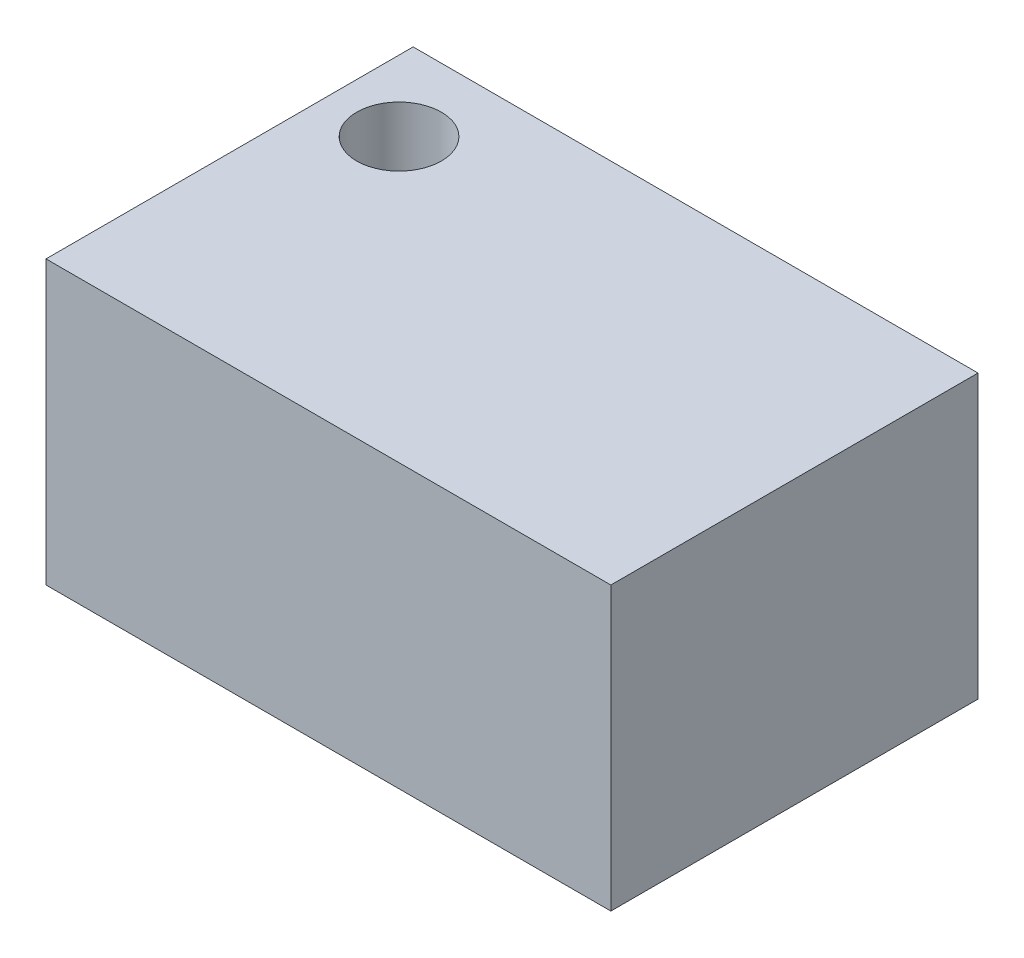
ISO-10303-21;
HEADER;
FILE_DESCRIPTION(('STEP AP214'),'2;1');
FILE_NAME('part.step','',(''),(''),'','','');
FILE_SCHEMA(('AUTOMOTIVE_DESIGN { 1 0 10303 214 1 1 1 1 }'));
ENDSEC;
DATA;
#1=APPLICATION_CONTEXT('core data for automotive mechanical design processes');
#2=APPLICATION_PROTOCOL_DEFINITION('international standard','automotive_design',2000,#1);
#3=PRODUCT_CONTEXT('',#1,'mechanical');
#4=PRODUCT('Part','Part','',(#3));
#5=PRODUCT_RELATED_PRODUCT_CATEGORY('part','',(#4));
#6=PRODUCT_DEFINITION_FORMATION('','',#4);
#7=PRODUCT_DEFINITION_CONTEXT('part definition',#1,'design');
#8=PRODUCT_DEFINITION('design','',#6,#7);
#9=PRODUCT_DEFINITION_SHAPE('','',#8);
#10=(LENGTH_UNIT() NAMED_UNIT(*) SI_UNIT(.MILLI.,.METRE.));
#11=(NAMED_UNIT(*) PLANE_ANGLE_UNIT() SI_UNIT($,.RADIAN.));
#12=(NAMED_UNIT(*) SI_UNIT($,.STERADIAN.) SOLID_ANGLE_UNIT());
#13=UNCERTAINTY_MEASURE_WITH_UNIT(LENGTH_MEASURE(1.E-05),#10,'distance_accuracy_value','');
#14=(GEOMETRIC_REPRESENTATION_CONTEXT(3) GLOBAL_UNCERTAINTY_ASSIGNED_CONTEXT((#13)) GLOBAL_UNIT_ASSIGNED_CONTEXT((#10,
#11,#12)) REPRESENTATION_CONTEXT('',''));
#15=CARTESIAN_POINT('',(0.,0.,0.));
#16=DIRECTION('',(0.,0.,1.));
#17=DIRECTION('',(1.,0.,0.));
#18=AXIS2_PLACEMENT_3D('',#15,#16,#17);
#19=CARTESIAN_POINT('',(0.,10.,0.));
#20=DIRECTION('',(0.,-1.,0.));
#21=DIRECTION('',(0.,0.,-1.));
#22=AXIS2_PLACEMENT_3D('',#19,#20,#21);
#23=PLANE('',#22);
#24=DIRECTION('',(0.,0.,-1.));
#25=VECTOR('',#24,1.);
#26=CARTESIAN_POINT('',(10.,10.,6.5));
#27=LINE('',#26,#25);
#28=CARTESIAN_POINT('',(10.,10.,6.5));
#29=VERTEX_POINT('',#28);
#30=CARTESIAN_POINT('',(10.,10.,-6.5));
#31=VERTEX_POINT('',#30);
#32=EDGE_CURVE('E85',#29,#31,#27,.T.);
#33=ORIENTED_EDGE('',*,*,#32,.T.);
#34=DIRECTION('',(-1.,0.,0.));
#35=VECTOR('',#34,1.);
#36=CARTESIAN_POINT('',(-10.,10.,-6.5));
#37=LINE('',#36,#35);
#38=CARTESIAN_POINT('',(-10.,10.,-6.5));
#39=VERTEX_POINT('',#38);
#40=EDGE_CURVE('E80',#31,#39,#37,.T.);
#41=ORIENTED_EDGE('',*,*,#40,.T.);
#42=DIRECTION('',(0.,0.,1.));
#43=VECTOR('',#42,1.);
#44=CARTESIAN_POINT('',(-10.,10.,6.5));
#45=LINE('',#44,#43);
#46=CARTESIAN_POINT('',(-10.,10.,6.5));
#47=VERTEX_POINT('',#46);
#48=EDGE_CURVE('E83',#39,#47,#45,.T.);
#49=ORIENTED_EDGE('',*,*,#48,.T.);
#50=DIRECTION('',(1.,0.,0.));
#51=VECTOR('',#50,1.);
#52=CARTESIAN_POINT('',(-10.,10.,6.5));
#53=LINE('',#52,#51);
#54=EDGE_CURVE('E50',#47,#29,#53,.T.);
#55=ORIENTED_EDGE('',*,*,#54,.T.);
#56=EDGE_LOOP('',(#33,#41,#49,#55));
#57=FACE_BOUND('',#56,.T.);
#58=CARTESIAN_POINT('',(-7.5,10.,-3.5));
#59=DIRECTION('',(0.,1.,0.));
#60=DIRECTION('',(0.,0.,1.));
#61=AXIS2_PLACEMENT_3D('',#58,#59,#60);
#62=CIRCLE('',#61,1.5);
#63=CARTESIAN_POINT('',(-7.5,10.,-2.));
#64=VERTEX_POINT('',#63);
#65=EDGE_CURVE('E100',#64,#64,#62,.T.);
#66=ORIENTED_EDGE('',*,*,#65,.F.);
#67=EDGE_LOOP('',(#66));
#68=FACE_BOUND('',#67,.T.);
#69=ADVANCED_FACE('F33',(#57,#68),#23,.F.);
#70=CARTESIAN_POINT('',(0.,0.,0.));
#71=DIRECTION('',(0.,-1.,0.));
#72=DIRECTION('',(0.,0.,-1.));
#73=AXIS2_PLACEMENT_3D('',#70,#71,#72);
#74=PLANE('',#73);
#75=DIRECTION('',(0.,0.,-1.));
#76=VECTOR('',#75,1.);
#77=CARTESIAN_POINT('',(10.,0.,6.5));
#78=LINE('',#77,#76);
#79=CARTESIAN_POINT('',(10.,0.,6.5));
#80=VERTEX_POINT('',#79);
#81=CARTESIAN_POINT('',(10.,0.,-6.5));
#82=VERTEX_POINT('',#81);
#83=EDGE_CURVE('E97',#80,#82,#78,.T.);
#84=ORIENTED_EDGE('',*,*,#83,.F.);
#85=DIRECTION('',(1.,0.,0.));
#86=VECTOR('',#85,1.);
#87=CARTESIAN_POINT('',(-10.,0.,6.5));
#88=LINE('',#87,#86);
#89=CARTESIAN_POINT('',(-10.,0.,6.5));
#90=VERTEX_POINT('',#89);
#91=EDGE_CURVE('E73',#90,#80,#88,.T.);
#92=ORIENTED_EDGE('',*,*,#91,.F.);
#93=DIRECTION('',(0.,0.,1.));
#94=VECTOR('',#93,1.);
#95=CARTESIAN_POINT('',(-10.,0.,6.5));
#96=LINE('',#95,#94);
#97=CARTESIAN_POINT('',(-10.,0.,-6.5));
#98=VERTEX_POINT('',#97);
#99=EDGE_CURVE('E67',#98,#90,#96,.T.);
#100=ORIENTED_EDGE('',*,*,#99,.F.);
#101=DIRECTION('',(-1.,0.,0.));
#102=VECTOR('',#101,1.);
#103=CARTESIAN_POINT('',(-10.,0.,-6.5));
#104=LINE('',#103,#102);
#105=EDGE_CURVE('E89',#82,#98,#104,.T.);
#106=ORIENTED_EDGE('',*,*,#105,.F.);
#107=EDGE_LOOP('',(#84,#92,#100,#106));
#108=FACE_BOUND('',#107,.T.);
#109=CARTESIAN_POINT('',(-7.5,0.,-3.5));
#110=DIRECTION('',(0.,1.,0.));
#111=DIRECTION('',(0.,0.,1.));
#112=AXIS2_PLACEMENT_3D('',#109,#110,#111);
#113=CIRCLE('',#112,1.5);
#114=CARTESIAN_POINT('',(-7.5,0.,-2.));
#115=VERTEX_POINT('',#114);
#116=EDGE_CURVE('E112',#115,#115,#113,.T.);
#117=ORIENTED_EDGE('',*,*,#116,.T.);
#118=EDGE_LOOP('',(#117));
#119=FACE_BOUND('',#118,.T.);
#120=ADVANCED_FACE('F108',(#108,#119),#74,.T.);
#121=CARTESIAN_POINT('',(10.,10.,6.5));
#122=DIRECTION('',(-1.,0.,0.));
#123=DIRECTION('',(0.,0.,1.));
#124=AXIS2_PLACEMENT_3D('',#121,#122,#123);
#125=PLANE('',#124);
#126=ORIENTED_EDGE('',*,*,#83,.T.);
#127=DIRECTION('',(0.,-1.,0.));
#128=VECTOR('',#127,1.);
#129=CARTESIAN_POINT('',(10.,10.,-6.5));
#130=LINE('',#129,#128);
#131=EDGE_CURVE('E11',#31,#82,#130,.T.);
#132=ORIENTED_EDGE('',*,*,#131,.F.);
#133=ORIENTED_EDGE('',*,*,#32,.F.);
#134=DIRECTION('',(0.,-1.,0.));
#135=VECTOR('',#134,1.);
#136=CARTESIAN_POINT('',(10.,10.,6.5));
#137=LINE('',#136,#135);
#138=EDGE_CURVE('E93',#29,#80,#137,.T.);
#139=ORIENTED_EDGE('',*,*,#138,.T.);
#140=EDGE_LOOP('',(#126,#132,#133,#139));
#141=FACE_BOUND('',#140,.T.);
#142=ADVANCED_FACE('F35',(#141),#125,.F.);
#143=CARTESIAN_POINT('',(-10.,10.,-6.5));
#144=DIRECTION('',(0.,0.,1.));
#145=DIRECTION('',(1.,0.,0.));
#146=AXIS2_PLACEMENT_3D('',#143,#144,#145);
#147=PLANE('',#146);
#148=ORIENTED_EDGE('',*,*,#105,.T.);
#149=DIRECTION('',(0.,-1.,0.));
#150=VECTOR('',#149,1.);
#151=CARTESIAN_POINT('',(-10.,10.,-6.5));
#152=LINE('',#151,#150);
#153=EDGE_CURVE('E42',#39,#98,#152,.T.);
#154=ORIENTED_EDGE('',*,*,#153,.F.);
#155=ORIENTED_EDGE('',*,*,#40,.F.);
#156=ORIENTED_EDGE('',*,*,#131,.T.);
#157=EDGE_LOOP('',(#148,#154,#155,#156));
#158=FACE_BOUND('',#157,.T.);
#159=ADVANCED_FACE('F88',(#158),#147,.F.);
#160=CARTESIAN_POINT('',(-10.,10.,6.5));
#161=DIRECTION('',(1.,0.,0.));
#162=DIRECTION('',(0.,0.,-1.));
#163=AXIS2_PLACEMENT_3D('',#160,#161,#162);
#164=PLANE('',#163);
#165=ORIENTED_EDGE('',*,*,#99,.T.);
#166=DIRECTION('',(0.,-1.,0.));
#167=VECTOR('',#166,1.);
#168=CARTESIAN_POINT('',(-10.,10.,6.5));
#169=LINE('',#168,#167);
#170=EDGE_CURVE('E90',#47,#90,#169,.T.);
#171=ORIENTED_EDGE('',*,*,#170,.F.);
#172=ORIENTED_EDGE('',*,*,#48,.F.);
#173=ORIENTED_EDGE('',*,*,#153,.T.);
#174=EDGE_LOOP('',(#165,#171,#172,#173));
#175=FACE_BOUND('',#174,.T.);
#176=ADVANCED_FACE('F91',(#175),#164,.F.);
#177=CARTESIAN_POINT('',(-10.,10.,6.5));
#178=DIRECTION('',(0.,0.,-1.));
#179=DIRECTION('',(-1.,0.,0.));
#180=AXIS2_PLACEMENT_3D('',#177,#178,#179);
#181=PLANE('',#180);
#182=ORIENTED_EDGE('',*,*,#91,.T.);
#183=ORIENTED_EDGE('',*,*,#138,.F.);
#184=ORIENTED_EDGE('',*,*,#54,.F.);
#185=ORIENTED_EDGE('',*,*,#170,.T.);
#186=EDGE_LOOP('',(#182,#183,#184,#185));
#187=FACE_BOUND('',#186,.T.);
#188=ADVANCED_FACE('F105',(#187),#181,.F.);
#189=CARTESIAN_POINT('',(-7.5,10.,-3.5));
#190=DIRECTION('',(0.,-1.,0.));
#191=DIRECTION('',(0.,0.,-1.));
#192=AXIS2_PLACEMENT_3D('',#189,#190,#191);
#193=CYLINDRICAL_SURFACE('',#192,1.5);
#194=ORIENTED_EDGE('',*,*,#65,.T.);
#195=EDGE_LOOP('',(#194));
#196=FACE_BOUND('',#195,.T.);
#197=ORIENTED_EDGE('',*,*,#116,.F.);
#198=EDGE_LOOP('',(#197));
#199=FACE_BOUND('',#198,.T.);
#200=ADVANCED_FACE('F118',(#196,#199),#193,.F.);
#201=CLOSED_SHELL('',(#69,#120,#142,#159,#176,#188,#200));
#202=MANIFOLD_SOLID_BREP('B2',#201);
#203=ADVANCED_BREP_SHAPE_REPRESENTATION('',(#18,#202),#14);
#204=SHAPE_DEFINITION_REPRESENTATION(#9,#203);
ENDSEC;
END-ISO-10303-21;
